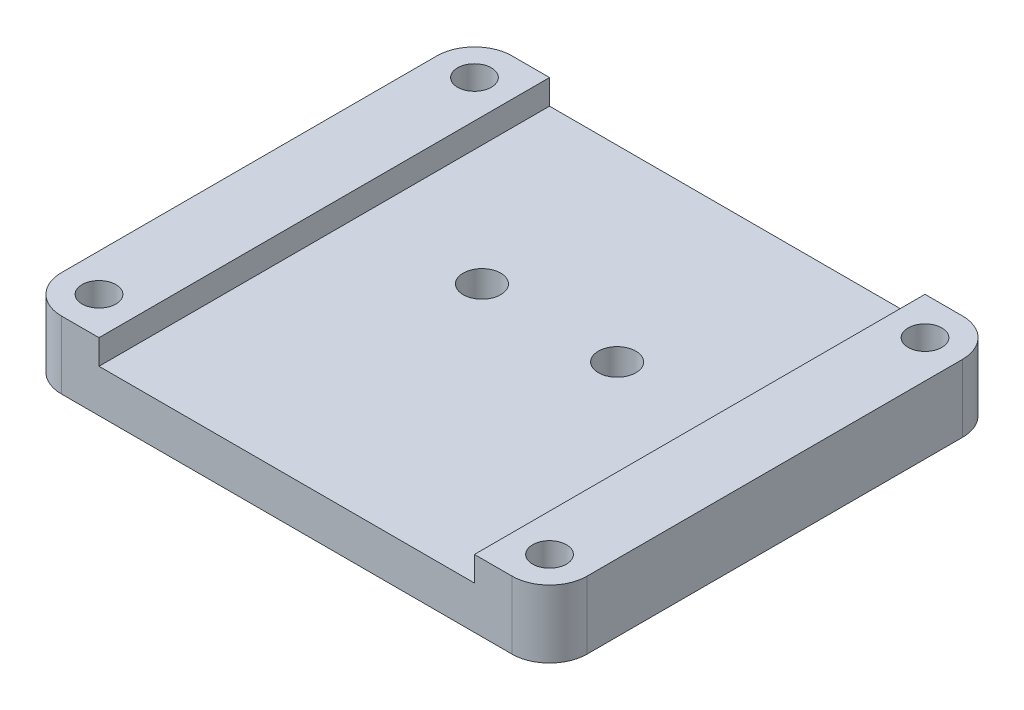
ISO-10303-21;
HEADER;
FILE_DESCRIPTION(('STEP AP214'),'2;1');
FILE_NAME('part.step','',(''),(''),'','','');
FILE_SCHEMA(('AUTOMOTIVE_DESIGN { 1 0 10303 214 1 1 1 1 }'));
ENDSEC;
DATA;
#1=APPLICATION_CONTEXT('core data for automotive mechanical design processes');
#2=APPLICATION_PROTOCOL_DEFINITION('international standard','automotive_design',2000,#1);
#3=PRODUCT_CONTEXT('',#1,'mechanical');
#4=PRODUCT('Part','Part','',(#3));
#5=PRODUCT_RELATED_PRODUCT_CATEGORY('part','',(#4));
#6=PRODUCT_DEFINITION_FORMATION('','',#4);
#7=PRODUCT_DEFINITION_CONTEXT('part definition',#1,'design');
#8=PRODUCT_DEFINITION('design','',#6,#7);
#9=PRODUCT_DEFINITION_SHAPE('','',#8);
#10=(LENGTH_UNIT() NAMED_UNIT(*) SI_UNIT(.MILLI.,.METRE.));
#11=(NAMED_UNIT(*) PLANE_ANGLE_UNIT() SI_UNIT($,.RADIAN.));
#12=(NAMED_UNIT(*) SI_UNIT($,.STERADIAN.) SOLID_ANGLE_UNIT());
#13=UNCERTAINTY_MEASURE_WITH_UNIT(LENGTH_MEASURE(1.E-05),#10,'distance_accuracy_value','');
#14=(GEOMETRIC_REPRESENTATION_CONTEXT(3) GLOBAL_UNCERTAINTY_ASSIGNED_CONTEXT((#13)) GLOBAL_UNIT_ASSIGNED_CONTEXT((#10,
#11,#12)) REPRESENTATION_CONTEXT('',''));
#15=CARTESIAN_POINT('',(0.,0.,0.));
#16=DIRECTION('',(0.,0.,1.));
#17=DIRECTION('',(1.,0.,0.));
#18=AXIS2_PLACEMENT_3D('',#15,#16,#17);
#19=CARTESIAN_POINT('',(0.,5.7,0.));
#20=DIRECTION('',(0.,-1.,0.));
#21=DIRECTION('',(0.,0.,-1.));
#22=AXIS2_PLACEMENT_3D('',#19,#20,#21);
#23=PLANE('',#22);
#24=DIRECTION('',(0.,0.,1.));
#25=VECTOR('',#24,1.);
#26=CARTESIAN_POINT('',(25.,5.7,0.));
#27=LINE('',#26,#25);
#28=CARTESIAN_POINT('',(25.,5.7,-30.));
#29=VERTEX_POINT('',#28);
#30=CARTESIAN_POINT('',(25.,5.7,30.));
#31=VERTEX_POINT('',#30);
#32=EDGE_CURVE('E282',#29,#31,#27,.T.);
#33=ORIENTED_EDGE('',*,*,#32,.F.);
#34=DIRECTION('',(1.,0.,0.));
#35=VECTOR('',#34,1.);
#36=CARTESIAN_POINT('',(-35.,5.7,-30.));
#37=LINE('',#36,#35);
#38=CARTESIAN_POINT('',(-25.,5.7,-30.));
#39=VERTEX_POINT('',#38);
#40=EDGE_CURVE('E159',#39,#29,#37,.T.);
#41=ORIENTED_EDGE('',*,*,#40,.F.);
#42=DIRECTION('',(0.,0.,1.));
#43=VECTOR('',#42,1.);
#44=CARTESIAN_POINT('',(-25.,5.7,0.));
#45=LINE('',#44,#43);
#46=CARTESIAN_POINT('',(-25.,5.7,30.));
#47=VERTEX_POINT('',#46);
#48=EDGE_CURVE('E160',#39,#47,#45,.T.);
#49=ORIENTED_EDGE('',*,*,#48,.T.);
#50=DIRECTION('',(1.,0.,0.));
#51=VECTOR('',#50,1.);
#52=CARTESIAN_POINT('',(-35.,5.7,30.));
#53=LINE('',#52,#51);
#54=EDGE_CURVE('E191',#47,#31,#53,.T.);
#55=ORIENTED_EDGE('',*,*,#54,.T.);
#56=EDGE_LOOP('',(#33,#41,#49,#55));
#57=FACE_BOUND('',#56,.T.);
#58=CARTESIAN_POINT('',(9.,5.7,-5.));
#59=DIRECTION('',(0.,1.,0.));
#60=DIRECTION('',(0.,0.,1.));
#61=AXIS2_PLACEMENT_3D('',#58,#59,#60);
#62=CIRCLE('',#61,2.5);
#63=CARTESIAN_POINT('',(9.,5.7,-2.50000000000001));
#64=VERTEX_POINT('',#63);
#65=EDGE_CURVE('E439',#64,#64,#62,.F.);
#66=ORIENTED_EDGE('',*,*,#65,.T.);
#67=EDGE_LOOP('',(#66));
#68=FACE_BOUND('',#67,.T.);
#69=CARTESIAN_POINT('',(-9.,5.7,-5.));
#70=DIRECTION('',(0.,1.,0.));
#71=DIRECTION('',(0.,0.,1.));
#72=AXIS2_PLACEMENT_3D('',#69,#70,#71);
#73=CIRCLE('',#72,2.5);
#74=CARTESIAN_POINT('',(-9.,5.7,-2.5));
#75=VERTEX_POINT('',#74);
#76=EDGE_CURVE('E431',#75,#75,#73,.T.);
#77=ORIENTED_EDGE('',*,*,#76,.F.);
#78=EDGE_LOOP('',(#77));
#79=FACE_BOUND('',#78,.T.);
#80=ADVANCED_FACE('F43',(#57,#68,#79),#23,.F.);
#81=CARTESIAN_POINT('',(-35.,5.7,-30.));
#82=DIRECTION('',(0.,0.,-1.));
#83=DIRECTION('',(-1.,0.,0.));
#84=AXIS2_PLACEMENT_3D('',#81,#82,#83);
#85=PLANE('',#84);
#86=DIRECTION('',(-1.,0.,0.));
#87=VECTOR('',#86,1.);
#88=CARTESIAN_POINT('',(0.,9.,-30.));
#89=LINE('',#88,#87);
#90=CARTESIAN_POINT('',(30.,9.,-30.));
#91=VERTEX_POINT('',#90);
#92=CARTESIAN_POINT('',(25.,9.,-30.));
#93=VERTEX_POINT('',#92);
#94=EDGE_CURVE('E131',#91,#93,#89,.T.);
#95=ORIENTED_EDGE('',*,*,#94,.F.);
#96=DIRECTION('',(0.,-1.,0.));
#97=VECTOR('',#96,1.);
#98=CARTESIAN_POINT('',(30.,5.7,-30.));
#99=LINE('',#98,#97);
#100=CARTESIAN_POINT('',(30.,0.,-30.));
#101=VERTEX_POINT('',#100);
#102=EDGE_CURVE('E234',#91,#101,#99,.T.);
#103=ORIENTED_EDGE('',*,*,#102,.T.);
#104=DIRECTION('',(1.,0.,0.));
#105=VECTOR('',#104,1.);
#106=CARTESIAN_POINT('',(-35.,0.,-30.));
#107=LINE('',#106,#105);
#108=CARTESIAN_POINT('',(-30.,0.,-30.));
#109=VERTEX_POINT('',#108);
#110=EDGE_CURVE('E195',#109,#101,#107,.T.);
#111=ORIENTED_EDGE('',*,*,#110,.F.);
#112=DIRECTION('',(0.,-1.,0.));
#113=VECTOR('',#112,1.);
#114=CARTESIAN_POINT('',(-30.,9.,-30.));
#115=LINE('',#114,#113);
#116=CARTESIAN_POINT('',(-30.,9.,-30.));
#117=VERTEX_POINT('',#116);
#118=EDGE_CURVE('E232',#109,#117,#115,.F.);
#119=ORIENTED_EDGE('',*,*,#118,.T.);
#120=DIRECTION('',(-1.,0.,0.));
#121=VECTOR('',#120,1.);
#122=CARTESIAN_POINT('',(0.,9.,-30.));
#123=LINE('',#122,#121);
#124=CARTESIAN_POINT('',(-25.,9.,-30.));
#125=VERTEX_POINT('',#124);
#126=EDGE_CURVE('E172',#125,#117,#123,.T.);
#127=ORIENTED_EDGE('',*,*,#126,.F.);
#128=DIRECTION('',(0.,-1.,0.));
#129=VECTOR('',#128,1.);
#130=CARTESIAN_POINT('',(-25.,9.,-30.));
#131=LINE('',#130,#129);
#132=EDGE_CURVE('E193',#125,#39,#131,.T.);
#133=ORIENTED_EDGE('',*,*,#132,.T.);
#134=ORIENTED_EDGE('',*,*,#40,.T.);
#135=DIRECTION('',(0.,-1.,0.));
#136=VECTOR('',#135,1.);
#137=CARTESIAN_POINT('',(25.,9.,-30.));
#138=LINE('',#137,#136);
#139=EDGE_CURVE('E149',#93,#29,#138,.T.);
#140=ORIENTED_EDGE('',*,*,#139,.F.);
#141=EDGE_LOOP('',(#95,#103,#111,#119,#127,#133,#134,#140));
#142=FACE_BOUND('',#141,.T.);
#143=ADVANCED_FACE('F157',(#142),#85,.T.);
#144=CARTESIAN_POINT('',(-35.,5.7,-30.));
#145=DIRECTION('',(1.,0.,0.));
#146=DIRECTION('',(0.,0.,-1.));
#147=AXIS2_PLACEMENT_3D('',#144,#145,#146);
#148=PLANE('',#147);
#149=DIRECTION('',(0.,0.,1.));
#150=VECTOR('',#149,1.);
#151=CARTESIAN_POINT('',(-35.,9.,0.));
#152=LINE('',#151,#150);
#153=CARTESIAN_POINT('',(-35.,9.,-25.));
#154=VERTEX_POINT('',#153);
#155=CARTESIAN_POINT('',(-35.,9.,25.));
#156=VERTEX_POINT('',#155);
#157=EDGE_CURVE('E174',#154,#156,#152,.T.);
#158=ORIENTED_EDGE('',*,*,#157,.F.);
#159=DIRECTION('',(0.,-1.,0.));
#160=VECTOR('',#159,1.);
#161=CARTESIAN_POINT('',(-35.,0.,-25.));
#162=LINE('',#161,#160);
#163=CARTESIAN_POINT('',(-35.,0.,-25.));
#164=VERTEX_POINT('',#163);
#165=EDGE_CURVE('E237',#154,#164,#162,.T.);
#166=ORIENTED_EDGE('',*,*,#165,.T.);
#167=DIRECTION('',(0.,0.,1.));
#168=VECTOR('',#167,1.);
#169=CARTESIAN_POINT('',(-35.,0.,-30.));
#170=LINE('',#169,#168);
#171=CARTESIAN_POINT('',(-35.,0.,25.));
#172=VERTEX_POINT('',#171);
#173=EDGE_CURVE('E197',#164,#172,#170,.T.);
#174=ORIENTED_EDGE('',*,*,#173,.T.);
#175=DIRECTION('',(0.,-1.,0.));
#176=VECTOR('',#175,1.);
#177=CARTESIAN_POINT('',(-35.,5.7,25.));
#178=LINE('',#177,#176);
#179=EDGE_CURVE('E58',#172,#156,#178,.F.);
#180=ORIENTED_EDGE('',*,*,#179,.T.);
#181=EDGE_LOOP('',(#158,#166,#174,#180));
#182=FACE_BOUND('',#181,.T.);
#183=ADVANCED_FACE('F254',(#182),#148,.F.);
#184=CARTESIAN_POINT('',(-35.,5.7,30.));
#185=DIRECTION('',(0.,0.,-1.));
#186=DIRECTION('',(-1.,0.,0.));
#187=AXIS2_PLACEMENT_3D('',#184,#185,#186);
#188=PLANE('',#187);
#189=DIRECTION('',(1.,0.,0.));
#190=VECTOR('',#189,1.);
#191=CARTESIAN_POINT('',(-35.,0.,30.));
#192=LINE('',#191,#190);
#193=CARTESIAN_POINT('',(-30.,0.,30.));
#194=VERTEX_POINT('',#193);
#195=CARTESIAN_POINT('',(30.,0.,30.));
#196=VERTEX_POINT('',#195);
#197=EDGE_CURVE('E205',#194,#196,#192,.T.);
#198=ORIENTED_EDGE('',*,*,#197,.T.);
#199=DIRECTION('',(0.,-1.,0.));
#200=VECTOR('',#199,1.);
#201=CARTESIAN_POINT('',(30.,9.,30.));
#202=LINE('',#201,#200);
#203=CARTESIAN_POINT('',(30.,9.,30.));
#204=VERTEX_POINT('',#203);
#205=EDGE_CURVE('E227',#196,#204,#202,.F.);
#206=ORIENTED_EDGE('',*,*,#205,.T.);
#207=DIRECTION('',(1.,0.,0.));
#208=VECTOR('',#207,1.);
#209=CARTESIAN_POINT('',(0.,9.,30.));
#210=LINE('',#209,#208);
#211=CARTESIAN_POINT('',(25.,9.,30.));
#212=VERTEX_POINT('',#211);
#213=EDGE_CURVE('E154',#212,#204,#210,.T.);
#214=ORIENTED_EDGE('',*,*,#213,.F.);
#215=DIRECTION('',(0.,-1.,0.));
#216=VECTOR('',#215,1.);
#217=CARTESIAN_POINT('',(25.,9.,30.));
#218=LINE('',#217,#216);
#219=EDGE_CURVE('E152',#212,#31,#218,.T.);
#220=ORIENTED_EDGE('',*,*,#219,.T.);
#221=ORIENTED_EDGE('',*,*,#54,.F.);
#222=DIRECTION('',(0.,-1.,0.));
#223=VECTOR('',#222,1.);
#224=CARTESIAN_POINT('',(-25.,9.,30.));
#225=LINE('',#224,#223);
#226=CARTESIAN_POINT('',(-25.,9.,30.));
#227=VERTEX_POINT('',#226);
#228=EDGE_CURVE('E183',#227,#47,#225,.T.);
#229=ORIENTED_EDGE('',*,*,#228,.F.);
#230=DIRECTION('',(1.,0.,0.));
#231=VECTOR('',#230,1.);
#232=CARTESIAN_POINT('',(0.,9.,30.));
#233=LINE('',#232,#231);
#234=CARTESIAN_POINT('',(-30.,9.,30.));
#235=VERTEX_POINT('',#234);
#236=EDGE_CURVE('E176',#235,#227,#233,.T.);
#237=ORIENTED_EDGE('',*,*,#236,.F.);
#238=DIRECTION('',(0.,-1.,0.));
#239=VECTOR('',#238,1.);
#240=CARTESIAN_POINT('',(-30.,5.7,30.));
#241=LINE('',#240,#239);
#242=EDGE_CURVE('E224',#235,#194,#241,.T.);
#243=ORIENTED_EDGE('',*,*,#242,.T.);
#244=EDGE_LOOP('',(#198,#206,#214,#220,#221,#229,#237,#243));
#245=FACE_BOUND('',#244,.T.);
#246=ADVANCED_FACE('F248',(#245),#188,.F.);
#247=CARTESIAN_POINT('',(35.,5.7,-30.));
#248=DIRECTION('',(1.,0.,0.));
#249=DIRECTION('',(0.,0.,-1.));
#250=AXIS2_PLACEMENT_3D('',#247,#248,#249);
#251=PLANE('',#250);
#252=DIRECTION('',(0.,0.,-1.));
#253=VECTOR('',#252,1.);
#254=CARTESIAN_POINT('',(35.,9.,0.));
#255=LINE('',#254,#253);
#256=CARTESIAN_POINT('',(35.,9.,25.));
#257=VERTEX_POINT('',#256);
#258=CARTESIAN_POINT('',(35.,9.,-25.));
#259=VERTEX_POINT('',#258);
#260=EDGE_CURVE('E269',#257,#259,#255,.T.);
#261=ORIENTED_EDGE('',*,*,#260,.F.);
#262=DIRECTION('',(0.,-1.,0.));
#263=VECTOR('',#262,1.);
#264=CARTESIAN_POINT('',(35.,0.,25.));
#265=LINE('',#264,#263);
#266=CARTESIAN_POINT('',(35.,0.,25.));
#267=VERTEX_POINT('',#266);
#268=EDGE_CURVE('E213',#257,#267,#265,.T.);
#269=ORIENTED_EDGE('',*,*,#268,.T.);
#270=DIRECTION('',(0.,0.,1.));
#271=VECTOR('',#270,1.);
#272=CARTESIAN_POINT('',(35.,0.,-30.));
#273=LINE('',#272,#271);
#274=CARTESIAN_POINT('',(35.,0.,-25.));
#275=VERTEX_POINT('',#274);
#276=EDGE_CURVE('E202',#275,#267,#273,.T.);
#277=ORIENTED_EDGE('',*,*,#276,.F.);
#278=DIRECTION('',(0.,-1.,0.));
#279=VECTOR('',#278,1.);
#280=CARTESIAN_POINT('',(35.,5.7,-25.));
#281=LINE('',#280,#279);
#282=EDGE_CURVE('E211',#275,#259,#281,.F.);
#283=ORIENTED_EDGE('',*,*,#282,.T.);
#284=EDGE_LOOP('',(#261,#269,#277,#283));
#285=FACE_BOUND('',#284,.T.);
#286=ADVANCED_FACE('F267',(#285),#251,.T.);
#287=CARTESIAN_POINT('',(0.,0.,0.));
#288=DIRECTION('',(0.,-1.,0.));
#289=DIRECTION('',(0.,0.,-1.));
#290=AXIS2_PLACEMENT_3D('',#287,#288,#289);
#291=PLANE('',#290);
#292=ORIENTED_EDGE('',*,*,#276,.T.);
#293=CARTESIAN_POINT('',(30.,0.,25.));
#294=DIRECTION('',(0.,-1.,0.));
#295=DIRECTION('',(0.,0.,-1.));
#296=AXIS2_PLACEMENT_3D('',#293,#294,#295);
#297=CIRCLE('',#296,5.);
#298=EDGE_CURVE('E222',#267,#196,#297,.T.);
#299=ORIENTED_EDGE('',*,*,#298,.T.);
#300=ORIENTED_EDGE('',*,*,#197,.F.);
#301=CARTESIAN_POINT('',(-30.,0.,25.));
#302=DIRECTION('',(0.,-1.,0.));
#303=DIRECTION('',(0.,0.,-1.));
#304=AXIS2_PLACEMENT_3D('',#301,#302,#303);
#305=CIRCLE('',#304,5.);
#306=EDGE_CURVE('E216',#194,#172,#305,.T.);
#307=ORIENTED_EDGE('',*,*,#306,.T.);
#308=ORIENTED_EDGE('',*,*,#173,.F.);
#309=CARTESIAN_POINT('',(-30.,0.,-25.));
#310=DIRECTION('',(0.,-1.,0.));
#311=DIRECTION('',(0.,0.,-1.));
#312=AXIS2_PLACEMENT_3D('',#309,#310,#311);
#313=CIRCLE('',#312,5.);
#314=EDGE_CURVE('E218',#164,#109,#313,.T.);
#315=ORIENTED_EDGE('',*,*,#314,.T.);
#316=ORIENTED_EDGE('',*,*,#110,.T.);
#317=CARTESIAN_POINT('',(30.,0.,-25.));
#318=DIRECTION('',(0.,-1.,0.));
#319=DIRECTION('',(0.,0.,-1.));
#320=AXIS2_PLACEMENT_3D('',#317,#318,#319);
#321=CIRCLE('',#320,5.);
#322=EDGE_CURVE('E220',#101,#275,#321,.T.);
#323=ORIENTED_EDGE('',*,*,#322,.T.);
#324=EDGE_LOOP('',(#292,#299,#300,#307,#308,#315,#316,#323));
#325=FACE_BOUND('',#324,.T.);
#326=ADVANCED_FACE('F253',(#325),#291,.T.);
#327=CARTESIAN_POINT('',(-25.,9.,0.));
#328=DIRECTION('',(1.,0.,0.));
#329=DIRECTION('',(0.,0.,-1.));
#330=AXIS2_PLACEMENT_3D('',#327,#328,#329);
#331=PLANE('',#330);
#332=ORIENTED_EDGE('',*,*,#48,.F.);
#333=ORIENTED_EDGE('',*,*,#132,.F.);
#334=DIRECTION('',(0.,0.,1.));
#335=VECTOR('',#334,1.);
#336=CARTESIAN_POINT('',(-25.,9.,0.));
#337=LINE('',#336,#335);
#338=EDGE_CURVE('E169',#125,#227,#337,.T.);
#339=ORIENTED_EDGE('',*,*,#338,.T.);
#340=ORIENTED_EDGE('',*,*,#228,.T.);
#341=EDGE_LOOP('',(#332,#333,#339,#340));
#342=FACE_BOUND('',#341,.T.);
#343=ADVANCED_FACE('F329',(#342),#331,.T.);
#344=CARTESIAN_POINT('',(-30.,9.,-25.));
#345=DIRECTION('',(0.,-1.,0.));
#346=DIRECTION('',(0.,0.,-1.));
#347=AXIS2_PLACEMENT_3D('',#344,#345,#346);
#348=CYLINDRICAL_SURFACE('',#347,2.25);
#349=CARTESIAN_POINT('',(-30.,9.,-25.));
#350=DIRECTION('',(0.,1.,0.));
#351=DIRECTION('',(0.,0.,1.));
#352=AXIS2_PLACEMENT_3D('',#349,#350,#351);
#353=CIRCLE('',#352,2.25);
#354=CARTESIAN_POINT('',(-30.,9.,-22.75));
#355=VERTEX_POINT('',#354);
#356=EDGE_CURVE('E178',#355,#355,#353,.T.);
#357=ORIENTED_EDGE('',*,*,#356,.T.);
#358=EDGE_LOOP('',(#357));
#359=FACE_BOUND('',#358,.T.);
#360=CARTESIAN_POINT('',(-30.,5.7,-25.));
#361=DIRECTION('',(0.,1.,0.));
#362=DIRECTION('',(0.,0.,1.));
#363=AXIS2_PLACEMENT_3D('',#360,#361,#362);
#364=CIRCLE('',#363,2.25);
#365=CARTESIAN_POINT('',(-30.,5.7,-22.75));
#366=VERTEX_POINT('',#365);
#367=EDGE_CURVE('E163',#366,#366,#364,.T.);
#368=ORIENTED_EDGE('',*,*,#367,.F.);
#369=EDGE_LOOP('',(#368));
#370=FACE_BOUND('',#369,.T.);
#371=ADVANCED_FACE('F326',(#359,#370),#348,.F.);
#372=CARTESIAN_POINT('',(-30.,9.,25.));
#373=DIRECTION('',(0.,-1.,0.));
#374=DIRECTION('',(0.,0.,-1.));
#375=AXIS2_PLACEMENT_3D('',#372,#373,#374);
#376=CYLINDRICAL_SURFACE('',#375,2.25);
#377=CARTESIAN_POINT('',(-30.,9.,25.));
#378=DIRECTION('',(0.,1.,0.));
#379=DIRECTION('',(0.,0.,1.));
#380=AXIS2_PLACEMENT_3D('',#377,#378,#379);
#381=CIRCLE('',#380,2.25);
#382=CARTESIAN_POINT('',(-30.,9.,27.25));
#383=VERTEX_POINT('',#382);
#384=EDGE_CURVE('E181',#383,#383,#381,.F.);
#385=ORIENTED_EDGE('',*,*,#384,.F.);
#386=EDGE_LOOP('',(#385));
#387=FACE_BOUND('',#386,.T.);
#388=CARTESIAN_POINT('',(-30.,5.7,25.));
#389=DIRECTION('',(0.,1.,0.));
#390=DIRECTION('',(0.,0.,1.));
#391=AXIS2_PLACEMENT_3D('',#388,#389,#390);
#392=CIRCLE('',#391,2.25);
#393=CARTESIAN_POINT('',(-30.,5.7,27.25));
#394=VERTEX_POINT('',#393);
#395=EDGE_CURVE('E187',#394,#394,#392,.F.);
#396=ORIENTED_EDGE('',*,*,#395,.T.);
#397=EDGE_LOOP('',(#396));
#398=FACE_BOUND('',#397,.T.);
#399=ADVANCED_FACE('F328',(#387,#398),#376,.F.);
#400=CARTESIAN_POINT('',(0.,9.,0.));
#401=DIRECTION('',(0.,1.,0.));
#402=DIRECTION('',(0.,0.,1.));
#403=AXIS2_PLACEMENT_3D('',#400,#401,#402);
#404=PLANE('',#403);
#405=ORIENTED_EDGE('',*,*,#126,.T.);
#406=CARTESIAN_POINT('',(-30.,9.,-25.));
#407=DIRECTION('',(0.,1.,0.));
#408=DIRECTION('',(0.,0.,1.));
#409=AXIS2_PLACEMENT_3D('',#406,#407,#408);
#410=CIRCLE('',#409,5.);
#411=EDGE_CURVE('E11',#117,#154,#410,.T.);
#412=ORIENTED_EDGE('',*,*,#411,.T.);
#413=ORIENTED_EDGE('',*,*,#157,.T.);
#414=CARTESIAN_POINT('',(-30.,9.,25.));
#415=DIRECTION('',(0.,1.,0.));
#416=DIRECTION('',(0.,0.,1.));
#417=AXIS2_PLACEMENT_3D('',#414,#415,#416);
#418=CIRCLE('',#417,5.);
#419=EDGE_CURVE('E51',#156,#235,#418,.T.);
#420=ORIENTED_EDGE('',*,*,#419,.T.);
#421=ORIENTED_EDGE('',*,*,#236,.T.);
#422=ORIENTED_EDGE('',*,*,#338,.F.);
#423=EDGE_LOOP('',(#405,#412,#413,#420,#421,#422));
#424=FACE_BOUND('',#423,.T.);
#425=ORIENTED_EDGE('',*,*,#356,.F.);
#426=EDGE_LOOP('',(#425));
#427=FACE_BOUND('',#426,.T.);
#428=ORIENTED_EDGE('',*,*,#384,.T.);
#429=EDGE_LOOP('',(#428));
#430=FACE_BOUND('',#429,.T.);
#431=ADVANCED_FACE('F241',(#424,#427,#430),#404,.T.);
#432=ORIENTED_EDGE('',*,*,#395,.F.);
#433=EDGE_LOOP('',(#432));
#434=FACE_BOUND('',#433,.T.);
#435=ADVANCED_FACE('F318',(#434),#23,.F.);
#436=ORIENTED_EDGE('',*,*,#367,.T.);
#437=EDGE_LOOP('',(#436));
#438=FACE_BOUND('',#437,.T.);
#439=ADVANCED_FACE('F300',(#438),#23,.F.);
#440=CARTESIAN_POINT('',(25.,9.,0.));
#441=DIRECTION('',(1.,0.,0.));
#442=DIRECTION('',(0.,0.,-1.));
#443=AXIS2_PLACEMENT_3D('',#440,#441,#442);
#444=PLANE('',#443);
#445=ORIENTED_EDGE('',*,*,#32,.T.);
#446=ORIENTED_EDGE('',*,*,#219,.F.);
#447=DIRECTION('',(0.,0.,1.));
#448=VECTOR('',#447,1.);
#449=CARTESIAN_POINT('',(25.,9.,0.));
#450=LINE('',#449,#448);
#451=EDGE_CURVE('E136',#93,#212,#450,.T.);
#452=ORIENTED_EDGE('',*,*,#451,.F.);
#453=ORIENTED_EDGE('',*,*,#139,.T.);
#454=EDGE_LOOP('',(#445,#446,#452,#453));
#455=FACE_BOUND('',#454,.T.);
#456=ADVANCED_FACE('F148',(#455),#444,.F.);
#457=CARTESIAN_POINT('',(30.,9.,25.));
#458=DIRECTION('',(0.,-1.,0.));
#459=DIRECTION('',(0.,0.,-1.));
#460=AXIS2_PLACEMENT_3D('',#457,#458,#459);
#461=CYLINDRICAL_SURFACE('',#460,2.25);
#462=CARTESIAN_POINT('',(30.,9.,25.));
#463=DIRECTION('',(0.,1.,0.));
#464=DIRECTION('',(0.,0.,1.));
#465=AXIS2_PLACEMENT_3D('',#462,#463,#464);
#466=CIRCLE('',#465,2.25);
#467=CARTESIAN_POINT('',(30.,9.,27.25));
#468=VERTEX_POINT('',#467);
#469=EDGE_CURVE('E275',#468,#468,#466,.T.);
#470=ORIENTED_EDGE('',*,*,#469,.T.);
#471=EDGE_LOOP('',(#470));
#472=FACE_BOUND('',#471,.T.);
#473=CARTESIAN_POINT('',(30.,5.7,25.));
#474=DIRECTION('',(0.,1.,0.));
#475=DIRECTION('',(0.,0.,1.));
#476=AXIS2_PLACEMENT_3D('',#473,#474,#475);
#477=CIRCLE('',#476,2.25);
#478=CARTESIAN_POINT('',(30.,5.7,27.25));
#479=VERTEX_POINT('',#478);
#480=EDGE_CURVE('E145',#479,#479,#477,.T.);
#481=ORIENTED_EDGE('',*,*,#480,.F.);
#482=EDGE_LOOP('',(#481));
#483=FACE_BOUND('',#482,.T.);
#484=ADVANCED_FACE('F289',(#472,#483),#461,.F.);
#485=CARTESIAN_POINT('',(30.,9.,-25.));
#486=DIRECTION('',(0.,-1.,0.));
#487=DIRECTION('',(0.,0.,-1.));
#488=AXIS2_PLACEMENT_3D('',#485,#486,#487);
#489=CYLINDRICAL_SURFACE('',#488,2.25);
#490=CARTESIAN_POINT('',(30.,9.,-25.));
#491=DIRECTION('',(0.,1.,0.));
#492=DIRECTION('',(0.,0.,1.));
#493=AXIS2_PLACEMENT_3D('',#490,#491,#492);
#494=CIRCLE('',#493,2.25);
#495=CARTESIAN_POINT('',(30.,9.,-22.75));
#496=VERTEX_POINT('',#495);
#497=EDGE_CURVE('E165',#496,#496,#494,.F.);
#498=ORIENTED_EDGE('',*,*,#497,.F.);
#499=EDGE_LOOP('',(#498));
#500=FACE_BOUND('',#499,.T.);
#501=CARTESIAN_POINT('',(30.,5.7,-25.));
#502=DIRECTION('',(0.,-1.,0.));
#503=DIRECTION('',(0.,0.,-1.));
#504=AXIS2_PLACEMENT_3D('',#501,#502,#503);
#505=CIRCLE('',#504,2.25);
#506=CARTESIAN_POINT('',(30.,5.7,-27.25));
#507=VERTEX_POINT('',#506);
#508=EDGE_CURVE('E190',#507,#507,#505,.T.);
#509=ORIENTED_EDGE('',*,*,#508,.T.);
#510=EDGE_LOOP('',(#509));
#511=FACE_BOUND('',#510,.T.);
#512=ADVANCED_FACE('F291',(#500,#511),#489,.F.);
#513=CARTESIAN_POINT('',(0.,9.,0.));
#514=DIRECTION('',(0.,1.,0.));
#515=DIRECTION('',(0.,0.,1.));
#516=AXIS2_PLACEMENT_3D('',#513,#514,#515);
#517=PLANE('',#516);
#518=ORIENTED_EDGE('',*,*,#213,.T.);
#519=CARTESIAN_POINT('',(30.,9.,25.));
#520=DIRECTION('',(0.,1.,0.));
#521=DIRECTION('',(0.,0.,1.));
#522=AXIS2_PLACEMENT_3D('',#519,#520,#521);
#523=CIRCLE('',#522,5.);
#524=EDGE_CURVE('E230',#204,#257,#523,.T.);
#525=ORIENTED_EDGE('',*,*,#524,.T.);
#526=ORIENTED_EDGE('',*,*,#260,.T.);
#527=CARTESIAN_POINT('',(30.,9.,-25.));
#528=DIRECTION('',(0.,1.,0.));
#529=DIRECTION('',(0.,0.,1.));
#530=AXIS2_PLACEMENT_3D('',#527,#528,#529);
#531=CIRCLE('',#530,5.);
#532=EDGE_CURVE('E140',#259,#91,#531,.T.);
#533=ORIENTED_EDGE('',*,*,#532,.T.);
#534=ORIENTED_EDGE('',*,*,#94,.T.);
#535=ORIENTED_EDGE('',*,*,#451,.T.);
#536=EDGE_LOOP('',(#518,#525,#526,#533,#534,#535));
#537=FACE_BOUND('',#536,.T.);
#538=ORIENTED_EDGE('',*,*,#469,.F.);
#539=EDGE_LOOP('',(#538));
#540=FACE_BOUND('',#539,.T.);
#541=ORIENTED_EDGE('',*,*,#497,.T.);
#542=EDGE_LOOP('',(#541));
#543=FACE_BOUND('',#542,.T.);
#544=ADVANCED_FACE('F134',(#537,#540,#543),#517,.T.);
#545=ORIENTED_EDGE('',*,*,#508,.F.);
#546=EDGE_LOOP('',(#545));
#547=FACE_BOUND('',#546,.T.);
#548=ADVANCED_FACE('F305',(#547),#23,.F.);
#549=ORIENTED_EDGE('',*,*,#480,.T.);
#550=EDGE_LOOP('',(#549));
#551=FACE_BOUND('',#550,.T.);
#552=ADVANCED_FACE('F287',(#551),#23,.F.);
#553=CARTESIAN_POINT('',(30.,5.7,25.));
#554=DIRECTION('',(0.,1.,0.));
#555=DIRECTION('',(0.,0.,1.));
#556=AXIS2_PLACEMENT_3D('',#553,#554,#555);
#557=CYLINDRICAL_SURFACE('',#556,5.);
#558=ORIENTED_EDGE('',*,*,#524,.F.);
#559=ORIENTED_EDGE('',*,*,#205,.F.);
#560=ORIENTED_EDGE('',*,*,#298,.F.);
#561=ORIENTED_EDGE('',*,*,#268,.F.);
#562=EDGE_LOOP('',(#558,#559,#560,#561));
#563=FACE_BOUND('',#562,.T.);
#564=ADVANCED_FACE('F272',(#563),#557,.T.);
#565=CARTESIAN_POINT('',(30.,5.7,-25.));
#566=DIRECTION('',(0.,-1.,0.));
#567=DIRECTION('',(0.,0.,-1.));
#568=AXIS2_PLACEMENT_3D('',#565,#566,#567);
#569=CYLINDRICAL_SURFACE('',#568,5.);
#570=ORIENTED_EDGE('',*,*,#532,.F.);
#571=ORIENTED_EDGE('',*,*,#282,.F.);
#572=ORIENTED_EDGE('',*,*,#322,.F.);
#573=ORIENTED_EDGE('',*,*,#102,.F.);
#574=EDGE_LOOP('',(#570,#571,#572,#573));
#575=FACE_BOUND('',#574,.T.);
#576=ADVANCED_FACE('F262',(#575),#569,.T.);
#577=CARTESIAN_POINT('',(-30.,5.7,-25.));
#578=DIRECTION('',(0.,1.,0.));
#579=DIRECTION('',(0.,0.,1.));
#580=AXIS2_PLACEMENT_3D('',#577,#578,#579);
#581=CYLINDRICAL_SURFACE('',#580,5.);
#582=ORIENTED_EDGE('',*,*,#411,.F.);
#583=ORIENTED_EDGE('',*,*,#118,.F.);
#584=ORIENTED_EDGE('',*,*,#314,.F.);
#585=ORIENTED_EDGE('',*,*,#165,.F.);
#586=EDGE_LOOP('',(#582,#583,#584,#585));
#587=FACE_BOUND('',#586,.T.);
#588=ADVANCED_FACE('F257',(#587),#581,.T.);
#589=CARTESIAN_POINT('',(-30.,5.7,25.));
#590=DIRECTION('',(0.,-1.,0.));
#591=DIRECTION('',(0.,0.,-1.));
#592=AXIS2_PLACEMENT_3D('',#589,#590,#591);
#593=CYLINDRICAL_SURFACE('',#592,5.);
#594=ORIENTED_EDGE('',*,*,#419,.F.);
#595=ORIENTED_EDGE('',*,*,#179,.F.);
#596=ORIENTED_EDGE('',*,*,#306,.F.);
#597=ORIENTED_EDGE('',*,*,#242,.F.);
#598=EDGE_LOOP('',(#594,#595,#596,#597));
#599=FACE_BOUND('',#598,.T.);
#600=ADVANCED_FACE('F45',(#599),#593,.T.);
#601=CARTESIAN_POINT('',(9.,0.7,-5.));
#602=DIRECTION('',(0.,1.,0.));
#603=DIRECTION('',(0.,0.,1.));
#604=AXIS2_PLACEMENT_3D('',#601,#602,#603);
#605=CYLINDRICAL_SURFACE('',#604,2.5);
#606=CARTESIAN_POINT('',(9.,0.7,-5.));
#607=DIRECTION('',(0.,1.,0.));
#608=DIRECTION('',(0.,0.,1.));
#609=AXIS2_PLACEMENT_3D('',#606,#607,#608);
#610=CIRCLE('',#609,2.5);
#611=CARTESIAN_POINT('',(9.,0.7,-2.50000000000001));
#612=VERTEX_POINT('',#611);
#613=EDGE_CURVE('E434',#612,#612,#610,.F.);
#614=ORIENTED_EDGE('',*,*,#613,.T.);
#615=EDGE_LOOP('',(#614));
#616=FACE_BOUND('',#615,.T.);
#617=ORIENTED_EDGE('',*,*,#65,.F.);
#618=EDGE_LOOP('',(#617));
#619=FACE_BOUND('',#618,.T.);
#620=ADVANCED_FACE('F382',(#616,#619),#605,.F.);
#621=CARTESIAN_POINT('',(0.,0.7,0.));
#622=DIRECTION('',(0.,1.,0.));
#623=DIRECTION('',(0.,0.,1.));
#624=AXIS2_PLACEMENT_3D('',#621,#622,#623);
#625=PLANE('',#624);
#626=ORIENTED_EDGE('',*,*,#613,.F.);
#627=EDGE_LOOP('',(#626));
#628=FACE_BOUND('',#627,.T.);
#629=ADVANCED_FACE('F396',(#628),#625,.T.);
#630=CARTESIAN_POINT('',(-9.,0.7,-5.));
#631=DIRECTION('',(0.,1.,0.));
#632=DIRECTION('',(0.,0.,1.));
#633=AXIS2_PLACEMENT_3D('',#630,#631,#632);
#634=CYLINDRICAL_SURFACE('',#633,2.5);
#635=CARTESIAN_POINT('',(-9.,0.7,-5.));
#636=DIRECTION('',(0.,1.,0.));
#637=DIRECTION('',(0.,0.,1.));
#638=AXIS2_PLACEMENT_3D('',#635,#636,#637);
#639=CIRCLE('',#638,2.5);
#640=CARTESIAN_POINT('',(-9.,0.7,-2.5));
#641=VERTEX_POINT('',#640);
#642=EDGE_CURVE('E283',#641,#641,#639,.T.);
#643=ORIENTED_EDGE('',*,*,#642,.F.);
#644=EDGE_LOOP('',(#643));
#645=FACE_BOUND('',#644,.T.);
#646=ORIENTED_EDGE('',*,*,#76,.T.);
#647=EDGE_LOOP('',(#646));
#648=FACE_BOUND('',#647,.T.);
#649=ADVANCED_FACE('F406',(#645,#648),#634,.F.);
#650=CARTESIAN_POINT('',(0.,0.7,0.));
#651=DIRECTION('',(0.,1.,0.));
#652=DIRECTION('',(0.,0.,1.));
#653=AXIS2_PLACEMENT_3D('',#650,#651,#652);
#654=PLANE('',#653);
#655=ORIENTED_EDGE('',*,*,#642,.T.);
#656=EDGE_LOOP('',(#655));
#657=FACE_BOUND('',#656,.T.);
#658=ADVANCED_FACE('F416',(#657),#654,.T.);
#659=CLOSED_SHELL('',(#80,#143,#183,#246,#286,#326,#343,#371,#399,#431,#435,#439,#456,#484,#512,
#544,#548,#552,#564,#576,#588,#600,#620,#629,#649,#658));
#660=MANIFOLD_SOLID_BREP('B2',#659);
#661=ADVANCED_BREP_SHAPE_REPRESENTATION('',(#18,#660),#14);
#662=SHAPE_DEFINITION_REPRESENTATION(#9,#661);
ENDSEC;
END-ISO-10303-21;
